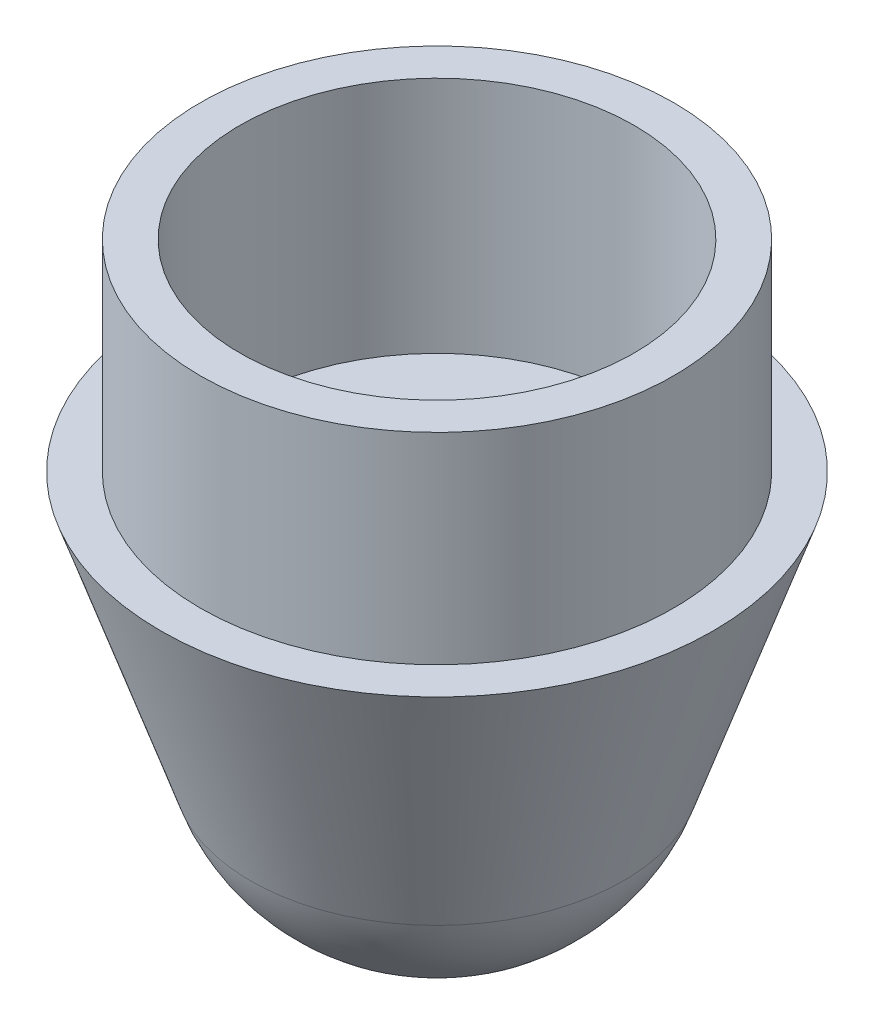
ISO-10303-21;
HEADER;
FILE_DESCRIPTION(('STEP AP214'),'2;1');
FILE_NAME('part.step','',(''),(''),'','','');
FILE_SCHEMA(('AUTOMOTIVE_DESIGN { 1 0 10303 214 1 1 1 1 }'));
ENDSEC;
DATA;
#1=APPLICATION_CONTEXT('core data for automotive mechanical design processes');
#2=APPLICATION_PROTOCOL_DEFINITION('international standard','automotive_design',2000,#1);
#3=PRODUCT_CONTEXT('',#1,'mechanical');
#4=PRODUCT('Part','Part','',(#3));
#5=PRODUCT_RELATED_PRODUCT_CATEGORY('part','',(#4));
#6=PRODUCT_DEFINITION_FORMATION('','',#4);
#7=PRODUCT_DEFINITION_CONTEXT('part definition',#1,'design');
#8=PRODUCT_DEFINITION('design','',#6,#7);
#9=PRODUCT_DEFINITION_SHAPE('','',#8);
#10=(LENGTH_UNIT() NAMED_UNIT(*) SI_UNIT(.MILLI.,.METRE.));
#11=(NAMED_UNIT(*) PLANE_ANGLE_UNIT() SI_UNIT($,.RADIAN.));
#12=(NAMED_UNIT(*) SI_UNIT($,.STERADIAN.) SOLID_ANGLE_UNIT());
#13=UNCERTAINTY_MEASURE_WITH_UNIT(LENGTH_MEASURE(1.E-05),#10,'distance_accuracy_value','');
#14=(GEOMETRIC_REPRESENTATION_CONTEXT(3) GLOBAL_UNCERTAINTY_ASSIGNED_CONTEXT((#13)) GLOBAL_UNIT_ASSIGNED_CONTEXT((#10,
#11,#12)) REPRESENTATION_CONTEXT('',''));
#15=CARTESIAN_POINT('',(0.,0.,0.));
#16=DIRECTION('',(0.,0.,1.));
#17=DIRECTION('',(1.,0.,0.));
#18=AXIS2_PLACEMENT_3D('',#15,#16,#17);
#19=CARTESIAN_POINT('',(-10.,0.,0.));
#20=DIRECTION('',(0.,-1.,0.));
#21=DIRECTION('',(0.,0.,-1.));
#22=AXIS2_PLACEMENT_3D('',#19,#20,#21);
#23=PLANE('',#22);
#24=CARTESIAN_POINT('',(0.,0.,0.));
#25=DIRECTION('',(0.,-1.,0.));
#26=DIRECTION('',(0.,0.,-1.));
#27=AXIS2_PLACEMENT_3D('',#24,#25,#26);
#28=CIRCLE('',#27,10.);
#29=CARTESIAN_POINT('',(0.,0.,-10.));
#30=VERTEX_POINT('',#29);
#31=EDGE_CURVE('E10',#30,#30,#28,.T.);
#32=ORIENTED_EDGE('',*,*,#31,.F.);
#33=EDGE_LOOP('',(#32));
#34=FACE_BOUND('',#33,.T.);
#35=ADVANCED_FACE('F40',(#34),#23,.F.);
#36=CARTESIAN_POINT('',(0.,0.,0.));
#37=DIRECTION('',(0.,-1.,0.));
#38=DIRECTION('',(0.,0.,-1.));
#39=AXIS2_PLACEMENT_3D('',#36,#37,#38);
#40=CYLINDRICAL_SURFACE('',#39,10.);
#41=CARTESIAN_POINT('',(0.,12.0833333333334,0.));
#42=DIRECTION('',(0.,-1.,0.));
#43=DIRECTION('',(0.,0.,-1.));
#44=AXIS2_PLACEMENT_3D('',#41,#42,#43);
#45=CIRCLE('',#44,10.);
#46=CARTESIAN_POINT('',(0.,12.0833333333334,-10.));
#47=VERTEX_POINT('',#46);
#48=EDGE_CURVE('E43',#47,#47,#45,.T.);
#49=ORIENTED_EDGE('',*,*,#48,.F.);
#50=EDGE_LOOP('',(#49));
#51=FACE_BOUND('',#50,.T.);
#52=ORIENTED_EDGE('',*,*,#31,.T.);
#53=EDGE_LOOP('',(#52));
#54=FACE_BOUND('',#53,.T.);
#55=ADVANCED_FACE('F82',(#51,#54),#40,.F.);
#56=CARTESIAN_POINT('',(-10.,12.0833333333334,0.));
#57=DIRECTION('',(0.,-1.,0.));
#58=DIRECTION('',(0.,0.,-1.));
#59=AXIS2_PLACEMENT_3D('',#56,#57,#58);
#60=PLANE('',#59);
#61=CARTESIAN_POINT('',(0.,12.0833333333334,0.));
#62=DIRECTION('',(0.,-1.,0.));
#63=DIRECTION('',(0.,0.,-1.));
#64=AXIS2_PLACEMENT_3D('',#61,#62,#63);
#65=CIRCLE('',#64,12.);
#66=CARTESIAN_POINT('',(0.,12.0833333333334,-12.));
#67=VERTEX_POINT('',#66);
#68=EDGE_CURVE('E50',#67,#67,#65,.T.);
#69=ORIENTED_EDGE('',*,*,#68,.F.);
#70=EDGE_LOOP('',(#69));
#71=FACE_BOUND('',#70,.T.);
#72=ORIENTED_EDGE('',*,*,#48,.T.);
#73=EDGE_LOOP('',(#72));
#74=FACE_BOUND('',#73,.T.);
#75=ADVANCED_FACE('F79',(#71,#74),#60,.F.);
#76=CARTESIAN_POINT('',(0.,0.,0.));
#77=DIRECTION('',(0.,-1.,0.));
#78=DIRECTION('',(0.,0.,-1.));
#79=AXIS2_PLACEMENT_3D('',#76,#77,#78);
#80=CYLINDRICAL_SURFACE('',#79,12.);
#81=CARTESIAN_POINT('',(0.,1.88066873412248,0.));
#82=DIRECTION('',(0.,-1.,0.));
#83=DIRECTION('',(0.,0.,-1.));
#84=AXIS2_PLACEMENT_3D('',#81,#82,#83);
#85=CIRCLE('',#84,12.);
#86=CARTESIAN_POINT('',(0.,1.88066873412248,-12.));
#87=VERTEX_POINT('',#86);
#88=EDGE_CURVE('E51',#87,#87,#85,.T.);
#89=ORIENTED_EDGE('',*,*,#88,.F.);
#90=EDGE_LOOP('',(#89));
#91=FACE_BOUND('',#90,.T.);
#92=ORIENTED_EDGE('',*,*,#68,.T.);
#93=EDGE_LOOP('',(#92));
#94=FACE_BOUND('',#93,.T.);
#95=ADVANCED_FACE('F73',(#91,#94),#80,.T.);
#96=CARTESIAN_POINT('',(-12.,1.88066873412248,0.));
#97=DIRECTION('',(0.,-1.,0.));
#98=DIRECTION('',(0.,0.,-1.));
#99=AXIS2_PLACEMENT_3D('',#96,#97,#98);
#100=PLANE('',#99);
#101=CARTESIAN_POINT('',(0.,1.88066873412248,0.));
#102=DIRECTION('',(0.,-1.,0.));
#103=DIRECTION('',(0.,0.,-1.));
#104=AXIS2_PLACEMENT_3D('',#101,#102,#103);
#105=CIRCLE('',#104,14.);
#106=CARTESIAN_POINT('',(0.,1.88066873412248,-14.));
#107=VERTEX_POINT('',#106);
#108=EDGE_CURVE('E57',#107,#107,#105,.T.);
#109=ORIENTED_EDGE('',*,*,#108,.F.);
#110=EDGE_LOOP('',(#109));
#111=FACE_BOUND('',#110,.T.);
#112=ORIENTED_EDGE('',*,*,#88,.T.);
#113=EDGE_LOOP('',(#112));
#114=FACE_BOUND('',#113,.T.);
#115=ADVANCED_FACE('F66',(#111,#114),#100,.F.);
#116=CARTESIAN_POINT('',(0.,1.88066873412248,0.));
#117=DIRECTION('',(0.,1.,0.));
#118=DIRECTION('',(0.,0.,1.));
#119=AXIS2_PLACEMENT_3D('',#116,#117,#118);
#120=CONICAL_SURFACE('',#119,14.,0.330297354829254);
#121=CARTESIAN_POINT('',(0.,-11.3625745091208,0.));
#122=DIRECTION('',(0.,-1.,0.));
#123=DIRECTION('',(0.,0.,-1.));
#124=AXIS2_PLACEMENT_3D('',#121,#122,#123);
#125=CIRCLE('',#124,9.45945945945946);
#126=CARTESIAN_POINT('',(0.,-11.3625745091208,-9.45945945945946));
#127=VERTEX_POINT('',#126);
#128=EDGE_CURVE('E56',#127,#127,#125,.T.);
#129=ORIENTED_EDGE('',*,*,#128,.F.);
#130=EDGE_LOOP('',(#129));
#131=FACE_BOUND('',#130,.T.);
#132=ORIENTED_EDGE('',*,*,#108,.T.);
#133=EDGE_LOOP('',(#132));
#134=FACE_BOUND('',#133,.T.);
#135=ADVANCED_FACE('F65',(#131,#134),#120,.T.);
#136=CARTESIAN_POINT('',(0.,-8.11933126587752,0.));
#137=DIRECTION('',(0.,-1.,0.));
#138=DIRECTION('',(-1.,0.,0.));
#139=AXIS2_PLACEMENT_3D('',#136,#137,#138);
#140=SPHERICAL_SURFACE('',#139,10.);
#141=ORIENTED_EDGE('',*,*,#128,.T.);
#142=EDGE_LOOP('',(#141));
#143=FACE_BOUND('',#142,.T.);
#144=ADVANCED_FACE('F64',(#143),#140,.T.);
#145=CLOSED_SHELL('',(#35,#55,#75,#95,#115,#135,#144));
#146=MANIFOLD_SOLID_BREP('B2',#145);
#147=ADVANCED_BREP_SHAPE_REPRESENTATION('',(#18,#146),#14);
#148=SHAPE_DEFINITION_REPRESENTATION(#9,#147);
ENDSEC;
END-ISO-10303-21;
